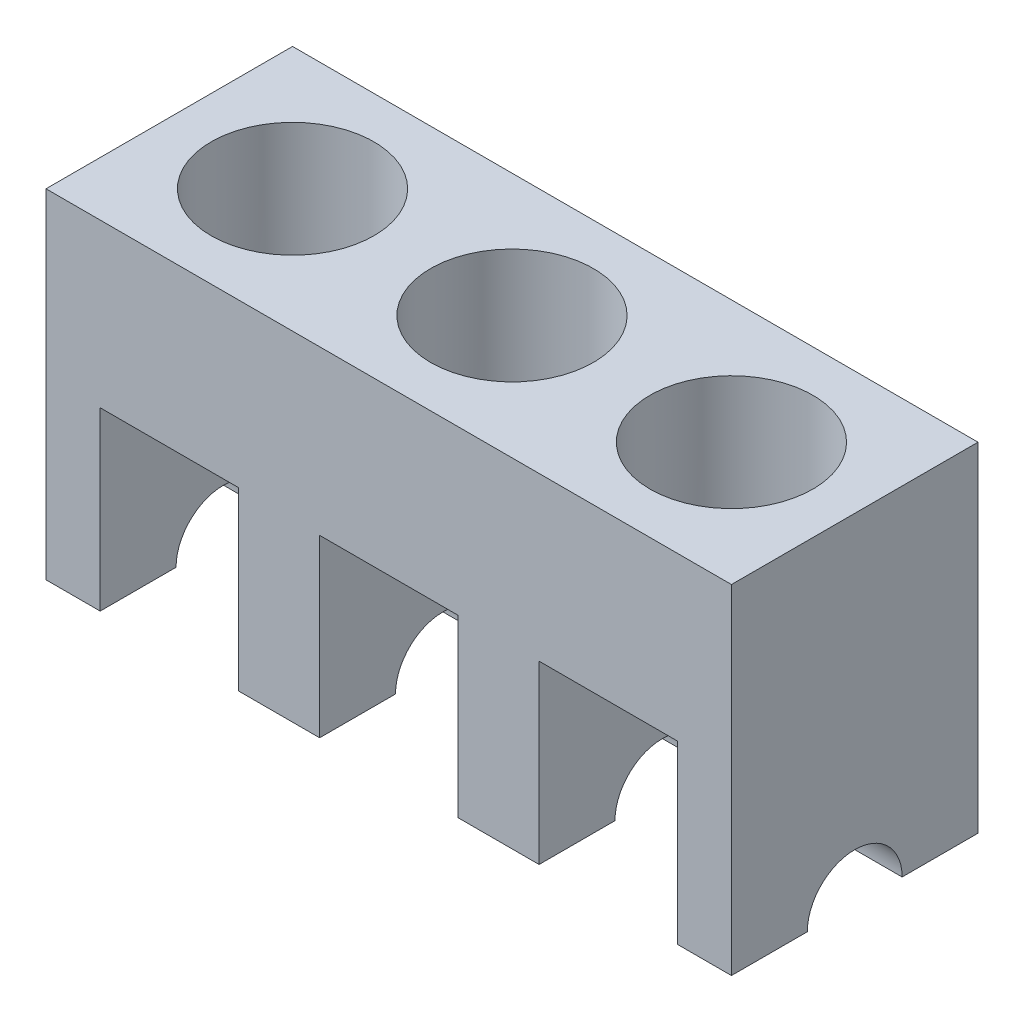
ISO-10303-21;
HEADER;
FILE_DESCRIPTION(('STEP AP214'),'2;1');
FILE_NAME('part.step','',(''),(''),'','','');
FILE_SCHEMA(('AUTOMOTIVE_DESIGN { 1 0 10303 214 1 1 1 1 }'));
ENDSEC;
DATA;
#1=APPLICATION_CONTEXT('core data for automotive mechanical design processes');
#2=APPLICATION_PROTOCOL_DEFINITION('international standard','automotive_design',2000,#1);
#3=PRODUCT_CONTEXT('',#1,'mechanical');
#4=PRODUCT('Part','Part','',(#3));
#5=PRODUCT_RELATED_PRODUCT_CATEGORY('part','',(#4));
#6=PRODUCT_DEFINITION_FORMATION('','',#4);
#7=PRODUCT_DEFINITION_CONTEXT('part definition',#1,'design');
#8=PRODUCT_DEFINITION('design','',#6,#7);
#9=PRODUCT_DEFINITION_SHAPE('','',#8);
#10=(LENGTH_UNIT() NAMED_UNIT(*) SI_UNIT(.MILLI.,.METRE.));
#11=(NAMED_UNIT(*) PLANE_ANGLE_UNIT() SI_UNIT($,.RADIAN.));
#12=(NAMED_UNIT(*) SI_UNIT($,.STERADIAN.) SOLID_ANGLE_UNIT());
#13=UNCERTAINTY_MEASURE_WITH_UNIT(LENGTH_MEASURE(1.E-05),#10,'distance_accuracy_value','');
#14=(GEOMETRIC_REPRESENTATION_CONTEXT(3) GLOBAL_UNCERTAINTY_ASSIGNED_CONTEXT((#13)) GLOBAL_UNIT_ASSIGNED_CONTEXT((#10,
#11,#12)) REPRESENTATION_CONTEXT('',''));
#15=CARTESIAN_POINT('',(0.,0.,0.));
#16=DIRECTION('',(0.,0.,1.));
#17=DIRECTION('',(1.,0.,0.));
#18=AXIS2_PLACEMENT_3D('',#15,#16,#17);
#19=CARTESIAN_POINT('',(0.,0.,0.));
#20=DIRECTION('',(0.,1.,0.));
#21=DIRECTION('',(0.,0.,1.));
#22=AXIS2_PLACEMENT_3D('',#19,#20,#21);
#23=PLANE('',#22);
#24=DIRECTION('',(0.,0.,1.));
#25=VECTOR('',#24,1.);
#26=CARTESIAN_POINT('',(-56.7788309636654,0.,-2284.41500789889));
#27=LINE('',#26,#25);
#28=CARTESIAN_POINT('',(-56.7788309636654,0.,-684.215007898894));
#29=VERTEX_POINT('',#28);
#30=CARTESIAN_POINT('',(-56.7788309636651,0.,26.9849921011058));
#31=VERTEX_POINT('',#30);
#32=EDGE_CURVE('E289',#29,#31,#27,.T.);
#33=ORIENTED_EDGE('',*,*,#32,.F.);
#34=DIRECTION('',(1.,0.,0.));
#35=VECTOR('',#34,1.);
#36=CARTESIAN_POINT('',(-56.7788309636654,0.,-684.215007898894));
#37=LINE('',#36,#35);
#38=CARTESIAN_POINT('',(451.221169036335,0.,-684.215007898894));
#39=VERTEX_POINT('',#38);
#40=EDGE_CURVE('E269',#29,#39,#37,.T.);
#41=ORIENTED_EDGE('',*,*,#40,.T.);
#42=DIRECTION('',(0.,0.,1.));
#43=VECTOR('',#42,1.);
#44=CARTESIAN_POINT('',(451.221169036335,0.,-2284.41500789889));
#45=LINE('',#44,#43);
#46=CARTESIAN_POINT('',(451.221169036335,0.,26.9849921011058));
#47=VERTEX_POINT('',#46);
#48=EDGE_CURVE('E554',#39,#47,#45,.T.);
#49=ORIENTED_EDGE('',*,*,#48,.T.);
#50=DIRECTION('',(1.,0.,0.));
#51=VECTOR('',#50,1.);
#52=CARTESIAN_POINT('',(-56.7788309636651,0.,26.9849921011058));
#53=LINE('',#52,#51);
#54=EDGE_CURVE('E293',#31,#47,#53,.T.);
#55=ORIENTED_EDGE('',*,*,#54,.F.);
#56=EDGE_LOOP('',(#33,#41,#49,#55));
#57=FACE_BOUND('',#56,.T.);
#58=ADVANCED_FACE('F35',(#57),#23,.F.);
#59=DIRECTION('',(0.,0.,1.));
#60=VECTOR('',#59,1.);
#61=CARTESIAN_POINT('',(1746.62116903633,0.,-2284.41500789889));
#62=LINE('',#61,#60);
#63=CARTESIAN_POINT('',(1746.62116903633,0.,-684.215007898894));
#64=VERTEX_POINT('',#63);
#65=CARTESIAN_POINT('',(1746.62116903633,0.,26.9849921011058));
#66=VERTEX_POINT('',#65);
#67=EDGE_CURVE('E540',#64,#66,#62,.T.);
#68=ORIENTED_EDGE('',*,*,#67,.F.);
#69=DIRECTION('',(1.,0.,0.));
#70=VECTOR('',#69,1.);
#71=CARTESIAN_POINT('',(-56.7788309636654,0.,-684.215007898894));
#72=LINE('',#71,#70);
#73=CARTESIAN_POINT('',(2508.62116903633,0.,-684.215007898894));
#74=VERTEX_POINT('',#73);
#75=EDGE_CURVE('E542',#64,#74,#72,.T.);
#76=ORIENTED_EDGE('',*,*,#75,.T.);
#77=DIRECTION('',(0.,0.,1.));
#78=VECTOR('',#77,1.);
#79=CARTESIAN_POINT('',(2508.62116903633,0.,0.));
#80=LINE('',#79,#78);
#81=CARTESIAN_POINT('',(2508.62116903633,0.,26.9849921011058));
#82=VERTEX_POINT('',#81);
#83=EDGE_CURVE('E414',#74,#82,#80,.T.);
#84=ORIENTED_EDGE('',*,*,#83,.T.);
#85=EDGE_CURVE('E300',#66,#82,#53,.T.);
#86=ORIENTED_EDGE('',*,*,#85,.F.);
#87=EDGE_LOOP('',(#68,#76,#84,#86));
#88=FACE_BOUND('',#87,.T.);
#89=ADVANCED_FACE('F538',(#88),#23,.F.);
#90=DIRECTION('',(0.,0.,-1.));
#91=VECTOR('',#90,1.);
#92=CARTESIAN_POINT('',(3804.02116903633,0.,0.));
#93=LINE('',#92,#91);
#94=CARTESIAN_POINT('',(3804.02116903633,0.,26.9849921011058));
#95=VERTEX_POINT('',#94);
#96=CARTESIAN_POINT('',(3804.02116903633,0.,-684.215007898894));
#97=VERTEX_POINT('',#96);
#98=EDGE_CURVE('E405',#95,#97,#93,.T.);
#99=ORIENTED_EDGE('',*,*,#98,.T.);
#100=DIRECTION('',(1.,0.,0.));
#101=VECTOR('',#100,1.);
#102=CARTESIAN_POINT('',(-56.7788309636654,0.,-684.215007898894));
#103=LINE('',#102,#101);
#104=CARTESIAN_POINT('',(4566.02116903633,0.,-684.215007898894));
#105=VERTEX_POINT('',#104);
#106=EDGE_CURVE('E520',#97,#105,#103,.T.);
#107=ORIENTED_EDGE('',*,*,#106,.T.);
#108=DIRECTION('',(0.,0.,1.));
#109=VECTOR('',#108,1.);
#110=CARTESIAN_POINT('',(4566.02116903633,0.,-2284.41500789889));
#111=LINE('',#110,#109);
#112=CARTESIAN_POINT('',(4566.02116903633,0.,26.9849921011058));
#113=VERTEX_POINT('',#112);
#114=EDGE_CURVE('E384',#105,#113,#111,.T.);
#115=ORIENTED_EDGE('',*,*,#114,.T.);
#116=EDGE_CURVE('E291',#95,#113,#53,.T.);
#117=ORIENTED_EDGE('',*,*,#116,.F.);
#118=EDGE_LOOP('',(#99,#107,#115,#117));
#119=FACE_BOUND('',#118,.T.);
#120=ADVANCED_FACE('F518',(#119),#23,.F.);
#121=DIRECTION('',(0.,0.,1.));
#122=VECTOR('',#121,1.);
#123=CARTESIAN_POINT('',(5861.42116903634,0.,-2284.41500789889));
#124=LINE('',#123,#122);
#125=CARTESIAN_POINT('',(5861.42116903634,0.,-684.215007898894));
#126=VERTEX_POINT('',#125);
#127=CARTESIAN_POINT('',(5861.42116903634,0.,26.9849921011058));
#128=VERTEX_POINT('',#127);
#129=EDGE_CURVE('E380',#126,#128,#124,.T.);
#130=ORIENTED_EDGE('',*,*,#129,.F.);
#131=DIRECTION('',(1.,0.,0.));
#132=VECTOR('',#131,1.);
#133=CARTESIAN_POINT('',(-56.7788309636654,0.,-684.215007898894));
#134=LINE('',#133,#132);
#135=CARTESIAN_POINT('',(6369.42116903633,0.,-684.215007898894));
#136=VERTEX_POINT('',#135);
#137=EDGE_CURVE('E594',#126,#136,#134,.T.);
#138=ORIENTED_EDGE('',*,*,#137,.T.);
#139=DIRECTION('',(0.,0.,-1.));
#140=VECTOR('',#139,1.);
#141=CARTESIAN_POINT('',(6369.42116903633,0.,26.9849921011058));
#142=LINE('',#141,#140);
#143=CARTESIAN_POINT('',(6369.42116903633,0.,26.9849921011058));
#144=VERTEX_POINT('',#143);
#145=EDGE_CURVE('E301',#144,#136,#142,.T.);
#146=ORIENTED_EDGE('',*,*,#145,.F.);
#147=EDGE_CURVE('E288',#128,#144,#53,.T.);
#148=ORIENTED_EDGE('',*,*,#147,.F.);
#149=EDGE_LOOP('',(#130,#138,#146,#148));
#150=FACE_BOUND('',#149,.T.);
#151=ADVANCED_FACE('F650',(#150),#23,.F.);
#152=CARTESIAN_POINT('',(451.221169036335,0.,-2284.41500789889));
#153=VERTEX_POINT('',#152);
#154=CARTESIAN_POINT('',(451.221169036335,0.,-1573.21500789889));
#155=VERTEX_POINT('',#154);
#156=EDGE_CURVE('E282',#153,#155,#45,.T.);
#157=ORIENTED_EDGE('',*,*,#156,.T.);
#158=DIRECTION('',(1.,0.,0.));
#159=VECTOR('',#158,1.);
#160=CARTESIAN_POINT('',(-56.7788309636654,0.,-1573.21500789889));
#161=LINE('',#160,#159);
#162=CARTESIAN_POINT('',(-56.7788309636654,0.,-1573.21500789889));
#163=VERTEX_POINT('',#162);
#164=EDGE_CURVE('E50',#155,#163,#161,.F.);
#165=ORIENTED_EDGE('',*,*,#164,.T.);
#166=CARTESIAN_POINT('',(-56.7788309636654,0.,-2284.41500789889));
#167=VERTEX_POINT('',#166);
#168=EDGE_CURVE('E280',#167,#163,#27,.T.);
#169=ORIENTED_EDGE('',*,*,#168,.F.);
#170=DIRECTION('',(-1.,0.,0.));
#171=VECTOR('',#170,1.);
#172=CARTESIAN_POINT('',(6369.42116903633,0.,-2284.41500789889));
#173=LINE('',#172,#171);
#174=EDGE_CURVE('E433',#153,#167,#173,.T.);
#175=ORIENTED_EDGE('',*,*,#174,.F.);
#176=EDGE_LOOP('',(#157,#165,#169,#175));
#177=FACE_BOUND('',#176,.T.);
#178=ADVANCED_FACE('F278',(#177),#23,.F.);
#179=CARTESIAN_POINT('',(2508.62116903633,0.,-2284.41500789889));
#180=VERTEX_POINT('',#179);
#181=CARTESIAN_POINT('',(2508.62116903633,0.,-1573.21500789889));
#182=VERTEX_POINT('',#181);
#183=EDGE_CURVE('E415',#180,#182,#80,.T.);
#184=ORIENTED_EDGE('',*,*,#183,.T.);
#185=DIRECTION('',(1.,0.,0.));
#186=VECTOR('',#185,1.);
#187=CARTESIAN_POINT('',(-56.7788309636654,0.,-1573.21500789889));
#188=LINE('',#187,#186);
#189=CARTESIAN_POINT('',(1746.62116903633,0.,-1573.21500789889));
#190=VERTEX_POINT('',#189);
#191=EDGE_CURVE('E58',#182,#190,#188,.F.);
#192=ORIENTED_EDGE('',*,*,#191,.T.);
#193=CARTESIAN_POINT('',(1746.62116903633,0.,-2284.41500789889));
#194=VERTEX_POINT('',#193);
#195=EDGE_CURVE('E555',#194,#190,#62,.T.);
#196=ORIENTED_EDGE('',*,*,#195,.F.);
#197=EDGE_CURVE('E468',#180,#194,#173,.T.);
#198=ORIENTED_EDGE('',*,*,#197,.F.);
#199=EDGE_LOOP('',(#184,#192,#196,#198));
#200=FACE_BOUND('',#199,.T.);
#201=ADVANCED_FACE('F641',(#200),#23,.F.);
#202=CARTESIAN_POINT('',(4566.02116903633,0.,-2284.41500789889));
#203=VERTEX_POINT('',#202);
#204=CARTESIAN_POINT('',(4566.02116903633,0.,-1573.21500789889));
#205=VERTEX_POINT('',#204);
#206=EDGE_CURVE('E381',#203,#205,#111,.T.);
#207=ORIENTED_EDGE('',*,*,#206,.T.);
#208=DIRECTION('',(1.,0.,0.));
#209=VECTOR('',#208,1.);
#210=CARTESIAN_POINT('',(-56.7788309636654,0.,-1573.21500789889));
#211=LINE('',#210,#209);
#212=CARTESIAN_POINT('',(3804.02116903633,0.,-1573.21500789889));
#213=VERTEX_POINT('',#212);
#214=EDGE_CURVE('E482',#205,#213,#211,.F.);
#215=ORIENTED_EDGE('',*,*,#214,.T.);
#216=CARTESIAN_POINT('',(3804.02116903633,0.,-2284.41500789889));
#217=VERTEX_POINT('',#216);
#218=EDGE_CURVE('E404',#213,#217,#93,.T.);
#219=ORIENTED_EDGE('',*,*,#218,.T.);
#220=EDGE_CURVE('E470',#203,#217,#173,.T.);
#221=ORIENTED_EDGE('',*,*,#220,.F.);
#222=EDGE_LOOP('',(#207,#215,#219,#221));
#223=FACE_BOUND('',#222,.T.);
#224=ADVANCED_FACE('F479',(#223),#23,.F.);
#225=CARTESIAN_POINT('',(0.,1117.6,0.));
#226=DIRECTION('',(0.,1.,0.));
#227=DIRECTION('',(0.,0.,1.));
#228=AXIS2_PLACEMENT_3D('',#225,#226,#227);
#229=PLANE('',#228);
#230=DIRECTION('',(0.,0.,1.));
#231=VECTOR('',#230,1.);
#232=CARTESIAN_POINT('',(4566.02116903633,1117.6,0.));
#233=LINE('',#232,#231);
#234=CARTESIAN_POINT('',(4566.02116903633,1117.6,-1532.52907761415));
#235=VERTEX_POINT('',#234);
#236=CARTESIAN_POINT('',(4566.02116903633,1117.6,-724.900938183634));
#237=VERTEX_POINT('',#236);
#238=EDGE_CURVE('E334',#235,#237,#233,.T.);
#239=ORIENTED_EDGE('',*,*,#238,.F.);
#240=CARTESIAN_POINT('',(5213.72116903633,1117.6,-1128.71500789889));
#241=DIRECTION('',(0.,1.,0.));
#242=DIRECTION('',(0.,0.,1.));
#243=AXIS2_PLACEMENT_3D('',#240,#241,#242);
#244=CIRCLE('',#243,763.27);
#245=EDGE_CURVE('E438',#237,#235,#244,.F.);
#246=ORIENTED_EDGE('',*,*,#245,.F.);
#247=EDGE_LOOP('',(#239,#246));
#248=FACE_BOUND('',#247,.T.);
#249=ADVANCED_FACE('F612',(#248),#229,.T.);
#250=CARTESIAN_POINT('',(0.,1117.6,0.));
#251=DIRECTION('',(0.,1.,0.));
#252=DIRECTION('',(0.,0.,1.));
#253=AXIS2_PLACEMENT_3D('',#250,#251,#252);
#254=PLANE('',#253);
#255=DIRECTION('',(0.,0.,1.));
#256=VECTOR('',#255,1.);
#257=CARTESIAN_POINT('',(2508.62116903633,1117.6,0.));
#258=LINE('',#257,#256);
#259=CARTESIAN_POINT('',(2508.62116903633,1117.6,-1532.52907761415));
#260=VERTEX_POINT('',#259);
#261=CARTESIAN_POINT('',(2508.62116903633,1117.6,-724.900938183634));
#262=VERTEX_POINT('',#261);
#263=EDGE_CURVE('E326',#260,#262,#258,.T.);
#264=ORIENTED_EDGE('',*,*,#263,.F.);
#265=CARTESIAN_POINT('',(3156.32116903633,1117.6,-1128.71500789889));
#266=DIRECTION('',(0.,1.,0.));
#267=DIRECTION('',(0.,0.,1.));
#268=AXIS2_PLACEMENT_3D('',#265,#266,#267);
#269=CIRCLE('',#268,763.27);
#270=EDGE_CURVE('E429',#262,#260,#269,.F.);
#271=ORIENTED_EDGE('',*,*,#270,.F.);
#272=EDGE_LOOP('',(#264,#271));
#273=FACE_BOUND('',#272,.T.);
#274=ADVANCED_FACE('F622',(#273),#254,.T.);
#275=CARTESIAN_POINT('',(0.,1117.6,0.));
#276=DIRECTION('',(0.,1.,0.));
#277=DIRECTION('',(0.,0.,1.));
#278=AXIS2_PLACEMENT_3D('',#275,#276,#277);
#279=PLANE('',#278);
#280=DIRECTION('',(0.,0.,1.));
#281=VECTOR('',#280,1.);
#282=CARTESIAN_POINT('',(451.221169036335,1117.6,0.));
#283=LINE('',#282,#281);
#284=CARTESIAN_POINT('',(451.221169036335,1117.6,-1532.52907761415));
#285=VERTEX_POINT('',#284);
#286=CARTESIAN_POINT('',(451.221169036335,1117.6,-724.900938183634));
#287=VERTEX_POINT('',#286);
#288=EDGE_CURVE('E318',#285,#287,#283,.T.);
#289=ORIENTED_EDGE('',*,*,#288,.F.);
#290=CARTESIAN_POINT('',(1098.92116903633,1117.6,-1128.71500789889));
#291=DIRECTION('',(0.,1.,0.));
#292=DIRECTION('',(0.,0.,1.));
#293=AXIS2_PLACEMENT_3D('',#290,#291,#292);
#294=CIRCLE('',#293,763.27);
#295=EDGE_CURVE('E430',#287,#285,#294,.F.);
#296=ORIENTED_EDGE('',*,*,#295,.F.);
#297=EDGE_LOOP('',(#289,#296));
#298=FACE_BOUND('',#297,.T.);
#299=ADVANCED_FACE('F662',(#298),#279,.T.);
#300=CARTESIAN_POINT('',(6369.42116903633,3175.,-2284.41500789889));
#301=DIRECTION('',(0.,0.,1.));
#302=DIRECTION('',(1.,0.,0.));
#303=AXIS2_PLACEMENT_3D('',#300,#301,#302);
#304=PLANE('',#303);
#305=DIRECTION('',(-1.,0.,0.));
#306=VECTOR('',#305,1.);
#307=CARTESIAN_POINT('',(451.221169036335,1651.,-2284.41500789889));
#308=LINE('',#307,#306);
#309=CARTESIAN_POINT('',(1746.62116903633,1651.,-2284.41500789889));
#310=VERTEX_POINT('',#309);
#311=CARTESIAN_POINT('',(451.221169036335,1651.,-2284.41500789889));
#312=VERTEX_POINT('',#311);
#313=EDGE_CURVE('E565',#310,#312,#308,.T.);
#314=ORIENTED_EDGE('',*,*,#313,.T.);
#315=DIRECTION('',(0.,-1.,0.));
#316=VECTOR('',#315,1.);
#317=CARTESIAN_POINT('',(451.221169036335,0.,-2284.41500789889));
#318=LINE('',#317,#316);
#319=EDGE_CURVE('E467',#312,#153,#318,.T.);
#320=ORIENTED_EDGE('',*,*,#319,.T.);
#321=ORIENTED_EDGE('',*,*,#174,.T.);
#322=DIRECTION('',(0.,-1.,0.));
#323=VECTOR('',#322,1.);
#324=CARTESIAN_POINT('',(-56.7788309636654,3175.,-2284.41500789889));
#325=LINE('',#324,#323);
#326=CARTESIAN_POINT('',(-56.7788309636654,3175.,-2284.41500789889));
#327=VERTEX_POINT('',#326);
#328=EDGE_CURVE('E287',#327,#167,#325,.T.);
#329=ORIENTED_EDGE('',*,*,#328,.F.);
#330=DIRECTION('',(-1.,0.,0.));
#331=VECTOR('',#330,1.);
#332=CARTESIAN_POINT('',(6369.42116903633,3175.,-2284.41500789889));
#333=LINE('',#332,#331);
#334=CARTESIAN_POINT('',(6369.42116903633,3175.,-2284.41500789889));
#335=VERTEX_POINT('',#334);
#336=EDGE_CURVE('E304',#335,#327,#333,.T.);
#337=ORIENTED_EDGE('',*,*,#336,.F.);
#338=DIRECTION('',(0.,-1.,0.));
#339=VECTOR('',#338,1.);
#340=CARTESIAN_POINT('',(6369.42116903633,3175.,-2284.41500789889));
#341=LINE('',#340,#339);
#342=CARTESIAN_POINT('',(6369.42116903633,0.,-2284.41500789889));
#343=VERTEX_POINT('',#342);
#344=EDGE_CURVE('E305',#335,#343,#341,.T.);
#345=ORIENTED_EDGE('',*,*,#344,.T.);
#346=CARTESIAN_POINT('',(5861.42116903634,0.,-2284.41500789889));
#347=VERTEX_POINT('',#346);
#348=EDGE_CURVE('E294',#343,#347,#173,.T.);
#349=ORIENTED_EDGE('',*,*,#348,.T.);
#350=DIRECTION('',(0.,1.,0.));
#351=VECTOR('',#350,1.);
#352=CARTESIAN_POINT('',(5861.42116903634,0.,-2284.41500789889));
#353=LINE('',#352,#351);
#354=CARTESIAN_POINT('',(5861.42116903634,1651.,-2284.41500789889));
#355=VERTEX_POINT('',#354);
#356=EDGE_CURVE('E514',#347,#355,#353,.T.);
#357=ORIENTED_EDGE('',*,*,#356,.T.);
#358=DIRECTION('',(-1.,0.,0.));
#359=VECTOR('',#358,1.);
#360=CARTESIAN_POINT('',(4566.02116903633,1651.,-2284.41500789889));
#361=LINE('',#360,#359);
#362=CARTESIAN_POINT('',(4566.02116903633,1651.,-2284.41500789889));
#363=VERTEX_POINT('',#362);
#364=EDGE_CURVE('E373',#355,#363,#361,.T.);
#365=ORIENTED_EDGE('',*,*,#364,.T.);
#366=DIRECTION('',(0.,-1.,0.));
#367=VECTOR('',#366,1.);
#368=CARTESIAN_POINT('',(4566.02116903633,0.,-2284.41500789889));
#369=LINE('',#368,#367);
#370=EDGE_CURVE('E363',#363,#203,#369,.T.);
#371=ORIENTED_EDGE('',*,*,#370,.T.);
#372=ORIENTED_EDGE('',*,*,#220,.T.);
#373=DIRECTION('',(0.,1.,0.));
#374=VECTOR('',#373,1.);
#375=CARTESIAN_POINT('',(3804.02116903633,-7.15828160284104,-2284.41500789889));
#376=LINE('',#375,#374);
#377=CARTESIAN_POINT('',(3804.02116903633,1643.84171839716,-2284.41500789889));
#378=VERTEX_POINT('',#377);
#379=EDGE_CURVE('E477',#217,#378,#376,.T.);
#380=ORIENTED_EDGE('',*,*,#379,.T.);
#381=DIRECTION('',(-1.,0.,0.));
#382=VECTOR('',#381,1.);
#383=CARTESIAN_POINT('',(2508.62116903633,1643.84171839716,-2284.41500789889));
#384=LINE('',#383,#382);
#385=CARTESIAN_POINT('',(2508.62116903633,1643.84171839716,-2284.41500789889));
#386=VERTEX_POINT('',#385);
#387=EDGE_CURVE('E489',#378,#386,#384,.T.);
#388=ORIENTED_EDGE('',*,*,#387,.T.);
#389=DIRECTION('',(0.,-1.,0.));
#390=VECTOR('',#389,1.);
#391=CARTESIAN_POINT('',(2508.62116903633,-7.15828160284104,-2284.41500789889));
#392=LINE('',#391,#390);
#393=EDGE_CURVE('E490',#386,#180,#392,.T.);
#394=ORIENTED_EDGE('',*,*,#393,.T.);
#395=ORIENTED_EDGE('',*,*,#197,.T.);
#396=DIRECTION('',(0.,1.,0.));
#397=VECTOR('',#396,1.);
#398=CARTESIAN_POINT('',(1746.62116903633,0.,-2284.41500789889));
#399=LINE('',#398,#397);
#400=EDGE_CURVE('E567',#194,#310,#399,.T.);
#401=ORIENTED_EDGE('',*,*,#400,.T.);
#402=EDGE_LOOP('',(#314,#320,#321,#329,#337,#345,#349,#357,#365,#371,#372,#380,#388,#394,#395,#401));
#403=FACE_BOUND('',#402,.T.);
#404=ADVANCED_FACE('F37',(#403),#304,.F.);
#405=CARTESIAN_POINT('',(-56.7788309636654,3175.,-2284.41500789889));
#406=DIRECTION('',(1.,0.,0.));
#407=DIRECTION('',(0.,0.,-1.));
#408=AXIS2_PLACEMENT_3D('',#405,#406,#407);
#409=PLANE('',#408);
#410=ORIENTED_EDGE('',*,*,#168,.T.);
#411=CARTESIAN_POINT('',(-56.7788309636654,0.,-1128.71500789889));
#412=DIRECTION('',(1.,0.,0.));
#413=DIRECTION('',(0.,0.,-1.));
#414=AXIS2_PLACEMENT_3D('',#411,#412,#413);
#415=CIRCLE('',#414,444.5);
#416=EDGE_CURVE('E266',#163,#29,#415,.T.);
#417=ORIENTED_EDGE('',*,*,#416,.T.);
#418=ORIENTED_EDGE('',*,*,#32,.T.);
#419=DIRECTION('',(0.,-1.,0.));
#420=VECTOR('',#419,1.);
#421=CARTESIAN_POINT('',(-56.7788309636651,3175.,26.9849921011058));
#422=LINE('',#421,#420);
#423=CARTESIAN_POINT('',(-56.7788309636651,3175.,26.9849921011058));
#424=VERTEX_POINT('',#423);
#425=EDGE_CURVE('E312',#424,#31,#422,.T.);
#426=ORIENTED_EDGE('',*,*,#425,.F.);
#427=DIRECTION('',(0.,0.,1.));
#428=VECTOR('',#427,1.);
#429=CARTESIAN_POINT('',(-56.7788309636654,3175.,-2284.41500789889));
#430=LINE('',#429,#428);
#431=EDGE_CURVE('E447',#327,#424,#430,.T.);
#432=ORIENTED_EDGE('',*,*,#431,.F.);
#433=ORIENTED_EDGE('',*,*,#328,.T.);
#434=EDGE_LOOP('',(#410,#417,#418,#426,#432,#433));
#435=FACE_BOUND('',#434,.T.);
#436=ADVANCED_FACE('F285',(#435),#409,.F.);
#437=CARTESIAN_POINT('',(-56.7788309636651,3175.,26.9849921011058));
#438=DIRECTION('',(0.,0.,-1.));
#439=DIRECTION('',(-1.,0.,0.));
#440=AXIS2_PLACEMENT_3D('',#437,#438,#439);
#441=PLANE('',#440);
#442=ORIENTED_EDGE('',*,*,#54,.T.);
#443=DIRECTION('',(0.,-1.,0.));
#444=VECTOR('',#443,1.);
#445=CARTESIAN_POINT('',(451.221169036335,0.,26.9849921011058));
#446=LINE('',#445,#444);
#447=CARTESIAN_POINT('',(451.221169036335,1651.,26.9849921011058));
#448=VERTEX_POINT('',#447);
#449=EDGE_CURVE('E502',#448,#47,#446,.T.);
#450=ORIENTED_EDGE('',*,*,#449,.F.);
#451=DIRECTION('',(-1.,0.,0.));
#452=VECTOR('',#451,1.);
#453=CARTESIAN_POINT('',(451.221169036335,1651.,26.9849921011058));
#454=LINE('',#453,#452);
#455=CARTESIAN_POINT('',(1746.62116903633,1651.,26.9849921011058));
#456=VERTEX_POINT('',#455);
#457=EDGE_CURVE('E571',#456,#448,#454,.T.);
#458=ORIENTED_EDGE('',*,*,#457,.F.);
#459=DIRECTION('',(0.,1.,0.));
#460=VECTOR('',#459,1.);
#461=CARTESIAN_POINT('',(1746.62116903633,0.,26.9849921011058));
#462=LINE('',#461,#460);
#463=EDGE_CURVE('E535',#66,#456,#462,.T.);
#464=ORIENTED_EDGE('',*,*,#463,.F.);
#465=ORIENTED_EDGE('',*,*,#85,.T.);
#466=DIRECTION('',(0.,-1.,0.));
#467=VECTOR('',#466,1.);
#468=CARTESIAN_POINT('',(2508.62116903633,-7.15828160284104,26.9849921011058));
#469=LINE('',#468,#467);
#470=CARTESIAN_POINT('',(2508.62116903633,1643.84171839716,26.9849921011058));
#471=VERTEX_POINT('',#470);
#472=EDGE_CURVE('E365',#471,#82,#469,.T.);
#473=ORIENTED_EDGE('',*,*,#472,.F.);
#474=DIRECTION('',(-1.,0.,0.));
#475=VECTOR('',#474,1.);
#476=CARTESIAN_POINT('',(2508.62116903633,1643.84171839716,26.9849921011058));
#477=LINE('',#476,#475);
#478=CARTESIAN_POINT('',(3804.02116903633,1643.84171839716,26.9849921011058));
#479=VERTEX_POINT('',#478);
#480=EDGE_CURVE('E495',#479,#471,#477,.T.);
#481=ORIENTED_EDGE('',*,*,#480,.F.);
#482=DIRECTION('',(0.,1.,0.));
#483=VECTOR('',#482,1.);
#484=CARTESIAN_POINT('',(3804.02116903633,-7.15828160284104,26.9849921011058));
#485=LINE('',#484,#483);
#486=EDGE_CURVE('E369',#95,#479,#485,.T.);
#487=ORIENTED_EDGE('',*,*,#486,.F.);
#488=ORIENTED_EDGE('',*,*,#116,.T.);
#489=DIRECTION('',(0.,-1.,0.));
#490=VECTOR('',#489,1.);
#491=CARTESIAN_POINT('',(4566.02116903633,0.,26.9849921011058));
#492=LINE('',#491,#490);
#493=CARTESIAN_POINT('',(4566.02116903633,1651.,26.9849921011058));
#494=VERTEX_POINT('',#493);
#495=EDGE_CURVE('E505',#494,#113,#492,.T.);
#496=ORIENTED_EDGE('',*,*,#495,.F.);
#497=DIRECTION('',(-1.,0.,0.));
#498=VECTOR('',#497,1.);
#499=CARTESIAN_POINT('',(4566.02116903633,1651.,26.9849921011058));
#500=LINE('',#499,#498);
#501=CARTESIAN_POINT('',(5861.42116903634,1651.,26.9849921011058));
#502=VERTEX_POINT('',#501);
#503=EDGE_CURVE('E511',#502,#494,#500,.T.);
#504=ORIENTED_EDGE('',*,*,#503,.F.);
#505=DIRECTION('',(0.,1.,0.));
#506=VECTOR('',#505,1.);
#507=CARTESIAN_POINT('',(5861.42116903634,0.,26.9849921011058));
#508=LINE('',#507,#506);
#509=EDGE_CURVE('E508',#128,#502,#508,.T.);
#510=ORIENTED_EDGE('',*,*,#509,.F.);
#511=ORIENTED_EDGE('',*,*,#147,.T.);
#512=DIRECTION('',(0.,-1.,0.));
#513=VECTOR('',#512,1.);
#514=CARTESIAN_POINT('',(6369.42116903633,3175.,26.9849921011058));
#515=LINE('',#514,#513);
#516=CARTESIAN_POINT('',(6369.42116903633,3175.,26.9849921011058));
#517=VERTEX_POINT('',#516);
#518=EDGE_CURVE('E308',#517,#144,#515,.T.);
#519=ORIENTED_EDGE('',*,*,#518,.F.);
#520=DIRECTION('',(1.,0.,0.));
#521=VECTOR('',#520,1.);
#522=CARTESIAN_POINT('',(-56.7788309636651,3175.,26.9849921011058));
#523=LINE('',#522,#521);
#524=EDGE_CURVE('E449',#424,#517,#523,.T.);
#525=ORIENTED_EDGE('',*,*,#524,.F.);
#526=ORIENTED_EDGE('',*,*,#425,.T.);
#527=EDGE_LOOP('',(#442,#450,#458,#464,#465,#473,#481,#487,#488,#496,#504,#510,#511,#519,#525,#526));
#528=FACE_BOUND('',#527,.T.);
#529=ADVANCED_FACE('F527',(#528),#441,.F.);
#530=CARTESIAN_POINT('',(6369.42116903633,3175.,26.9849921011058));
#531=DIRECTION('',(-1.,0.,0.));
#532=DIRECTION('',(0.,0.,1.));
#533=AXIS2_PLACEMENT_3D('',#530,#531,#532);
#534=PLANE('',#533);
#535=ORIENTED_EDGE('',*,*,#145,.T.);
#536=CARTESIAN_POINT('',(6369.42116903633,0.,-1128.71500789889));
#537=DIRECTION('',(-1.,0.,0.));
#538=DIRECTION('',(0.,0.,1.));
#539=AXIS2_PLACEMENT_3D('',#536,#537,#538);
#540=CIRCLE('',#539,444.5);
#541=CARTESIAN_POINT('',(6369.42116903633,0.,-1573.21500789889));
#542=VERTEX_POINT('',#541);
#543=EDGE_CURVE('E592',#136,#542,#540,.T.);
#544=ORIENTED_EDGE('',*,*,#543,.T.);
#545=EDGE_CURVE('E299',#542,#343,#142,.T.);
#546=ORIENTED_EDGE('',*,*,#545,.T.);
#547=ORIENTED_EDGE('',*,*,#344,.F.);
#548=DIRECTION('',(0.,0.,-1.));
#549=VECTOR('',#548,1.);
#550=CARTESIAN_POINT('',(6369.42116903633,3175.,26.9849921011058));
#551=LINE('',#550,#549);
#552=EDGE_CURVE('E309',#517,#335,#551,.T.);
#553=ORIENTED_EDGE('',*,*,#552,.F.);
#554=ORIENTED_EDGE('',*,*,#518,.T.);
#555=EDGE_LOOP('',(#535,#544,#546,#547,#553,#554));
#556=FACE_BOUND('',#555,.T.);
#557=ADVANCED_FACE('F458',(#556),#534,.F.);
#558=CARTESIAN_POINT('',(0.,3175.,0.));
#559=DIRECTION('',(0.,1.,0.));
#560=DIRECTION('',(0.,0.,1.));
#561=AXIS2_PLACEMENT_3D('',#558,#559,#560);
#562=PLANE('',#561);
#563=CARTESIAN_POINT('',(1098.92116903633,3175.,-1128.71500789889));
#564=DIRECTION('',(0.,1.,0.));
#565=DIRECTION('',(0.,0.,1.));
#566=AXIS2_PLACEMENT_3D('',#563,#564,#565);
#567=CIRCLE('',#566,763.27);
#568=CARTESIAN_POINT('',(1098.92116903633,3175.,-365.445007898894));
#569=VERTEX_POINT('',#568);
#570=EDGE_CURVE('E425',#569,#569,#567,.T.);
#571=ORIENTED_EDGE('',*,*,#570,.F.);
#572=EDGE_LOOP('',(#571));
#573=FACE_BOUND('',#572,.T.);
#574=CARTESIAN_POINT('',(3156.32116903633,3175.,-1128.71500789889));
#575=DIRECTION('',(0.,1.,0.));
#576=DIRECTION('',(0.,0.,1.));
#577=AXIS2_PLACEMENT_3D('',#574,#575,#576);
#578=CIRCLE('',#577,763.27);
#579=CARTESIAN_POINT('',(3156.32116903633,3175.,-365.445007898894));
#580=VERTEX_POINT('',#579);
#581=EDGE_CURVE('E434',#580,#580,#578,.T.);
#582=ORIENTED_EDGE('',*,*,#581,.F.);
#583=EDGE_LOOP('',(#582));
#584=FACE_BOUND('',#583,.T.);
#585=CARTESIAN_POINT('',(5213.72116903633,3175.,-1128.71500789889));
#586=DIRECTION('',(0.,1.,0.));
#587=DIRECTION('',(0.,0.,1.));
#588=AXIS2_PLACEMENT_3D('',#585,#586,#587);
#589=CIRCLE('',#588,763.27);
#590=CARTESIAN_POINT('',(5213.72116903633,3175.,-365.445007898894));
#591=VERTEX_POINT('',#590);
#592=EDGE_CURVE('E424',#591,#591,#589,.T.);
#593=ORIENTED_EDGE('',*,*,#592,.F.);
#594=EDGE_LOOP('',(#593));
#595=FACE_BOUND('',#594,.T.);
#596=ORIENTED_EDGE('',*,*,#336,.T.);
#597=ORIENTED_EDGE('',*,*,#431,.T.);
#598=ORIENTED_EDGE('',*,*,#524,.T.);
#599=ORIENTED_EDGE('',*,*,#552,.T.);
#600=EDGE_LOOP('',(#596,#597,#598,#599));
#601=FACE_BOUND('',#600,.T.);
#602=ADVANCED_FACE('F453',(#573,#584,#595,#601),#562,.T.);
#603=ORIENTED_EDGE('',*,*,#545,.F.);
#604=DIRECTION('',(1.,0.,0.));
#605=VECTOR('',#604,1.);
#606=CARTESIAN_POINT('',(-56.7788309636654,0.,-1573.21500789889));
#607=LINE('',#606,#605);
#608=CARTESIAN_POINT('',(5861.42116903634,0.,-1573.21500789889));
#609=VERTEX_POINT('',#608);
#610=EDGE_CURVE('E273',#542,#609,#607,.F.);
#611=ORIENTED_EDGE('',*,*,#610,.T.);
#612=EDGE_CURVE('E377',#347,#609,#124,.T.);
#613=ORIENTED_EDGE('',*,*,#612,.F.);
#614=ORIENTED_EDGE('',*,*,#348,.F.);
#615=EDGE_LOOP('',(#603,#611,#613,#614));
#616=FACE_BOUND('',#615,.T.);
#617=ADVANCED_FACE('F600',(#616),#23,.F.);
#618=CARTESIAN_POINT('',(5213.72116903633,-3098.65357150502,-1128.71500789889));
#619=DIRECTION('',(0.,1.,0.));
#620=DIRECTION('',(0.,0.,1.));
#621=AXIS2_PLACEMENT_3D('',#618,#619,#620);
#622=CYLINDRICAL_SURFACE('',#621,763.27);
#623=ORIENTED_EDGE('',*,*,#245,.T.);
#624=DIRECTION('',(0.,1.,0.));
#625=VECTOR('',#624,1.);
#626=CARTESIAN_POINT('',(4566.02116903633,-3098.65357150502,-1532.52907761415));
#627=LINE('',#626,#625);
#628=CARTESIAN_POINT('',(4566.02116903633,1651.,-1532.52907761415));
#629=VERTEX_POINT('',#628);
#630=EDGE_CURVE('E349',#235,#629,#627,.T.);
#631=ORIENTED_EDGE('',*,*,#630,.T.);
#632=CARTESIAN_POINT('',(5213.72116903633,1651.,-1128.71500789889));
#633=DIRECTION('',(0.,1.,0.));
#634=DIRECTION('',(0.,0.,1.));
#635=AXIS2_PLACEMENT_3D('',#632,#633,#634);
#636=CIRCLE('',#635,763.27);
#637=CARTESIAN_POINT('',(5861.42116903634,1651.,-1532.52907761415));
#638=VERTEX_POINT('',#637);
#639=EDGE_CURVE('E43',#629,#638,#636,.F.);
#640=ORIENTED_EDGE('',*,*,#639,.T.);
#641=DIRECTION('',(0.,1.,0.));
#642=VECTOR('',#641,1.);
#643=CARTESIAN_POINT('',(5861.42116903634,-3098.65357150502,-1532.52907761415));
#644=LINE('',#643,#642);
#645=CARTESIAN_POINT('',(5861.42116903634,1117.6,-1532.52907761415));
#646=VERTEX_POINT('',#645);
#647=EDGE_CURVE('E347',#638,#646,#644,.F.);
#648=ORIENTED_EDGE('',*,*,#647,.T.);
#649=CARTESIAN_POINT('',(5861.42116903634,1117.6,-724.900938183637));
#650=VERTEX_POINT('',#649);
#651=EDGE_CURVE('E443',#646,#650,#244,.F.);
#652=ORIENTED_EDGE('',*,*,#651,.T.);
#653=DIRECTION('',(0.,1.,0.));
#654=VECTOR('',#653,1.);
#655=CARTESIAN_POINT('',(5861.42116903634,-3098.65357150502,-724.900938183637));
#656=LINE('',#655,#654);
#657=CARTESIAN_POINT('',(5861.42116903634,1651.,-724.900938183637));
#658=VERTEX_POINT('',#657);
#659=EDGE_CURVE('E418',#650,#658,#656,.T.);
#660=ORIENTED_EDGE('',*,*,#659,.T.);
#661=CARTESIAN_POINT('',(4566.02116903633,1651.,-724.900938183634));
#662=VERTEX_POINT('',#661);
#663=EDGE_CURVE('E335',#658,#662,#636,.F.);
#664=ORIENTED_EDGE('',*,*,#663,.T.);
#665=DIRECTION('',(0.,1.,0.));
#666=VECTOR('',#665,1.);
#667=CARTESIAN_POINT('',(4566.02116903633,-3098.65357150502,-724.900938183634));
#668=LINE('',#667,#666);
#669=EDGE_CURVE('E422',#662,#237,#668,.F.);
#670=ORIENTED_EDGE('',*,*,#669,.T.);
#671=EDGE_LOOP('',(#623,#631,#640,#648,#652,#660,#664,#670));
#672=FACE_BOUND('',#671,.T.);
#673=ORIENTED_EDGE('',*,*,#592,.T.);
#674=EDGE_LOOP('',(#673));
#675=FACE_BOUND('',#674,.T.);
#676=ADVANCED_FACE('F344',(#672,#675),#622,.F.);
#677=DIRECTION('',(0.,0.,-1.));
#678=VECTOR('',#677,1.);
#679=CARTESIAN_POINT('',(5861.42116903634,1117.6,0.));
#680=LINE('',#679,#678);
#681=EDGE_CURVE('E332',#650,#646,#680,.T.);
#682=ORIENTED_EDGE('',*,*,#681,.F.);
#683=ORIENTED_EDGE('',*,*,#651,.F.);
#684=EDGE_LOOP('',(#682,#683));
#685=FACE_BOUND('',#684,.T.);
#686=ADVANCED_FACE('F608',(#685),#229,.T.);
#687=CARTESIAN_POINT('',(3156.32116903633,-3098.65357150502,-1128.71500789889));
#688=DIRECTION('',(0.,1.,0.));
#689=DIRECTION('',(0.,0.,1.));
#690=AXIS2_PLACEMENT_3D('',#687,#688,#689);
#691=CYLINDRICAL_SURFACE('',#690,763.27);
#692=ORIENTED_EDGE('',*,*,#270,.T.);
#693=DIRECTION('',(0.,1.,0.));
#694=VECTOR('',#693,1.);
#695=CARTESIAN_POINT('',(2508.62116903633,-3098.65357150502,-1532.52907761415));
#696=LINE('',#695,#694);
#697=CARTESIAN_POINT('',(2508.62116903633,1643.84171839716,-1532.52907761415));
#698=VERTEX_POINT('',#697);
#699=EDGE_CURVE('E408',#260,#698,#696,.T.);
#700=ORIENTED_EDGE('',*,*,#699,.T.);
#701=CARTESIAN_POINT('',(3156.32116903633,1643.84171839716,-1128.71500789889));
#702=DIRECTION('',(0.,1.,0.));
#703=DIRECTION('',(0.,0.,1.));
#704=AXIS2_PLACEMENT_3D('',#701,#702,#703);
#705=CIRCLE('',#704,763.27);
#706=CARTESIAN_POINT('',(3804.02116903633,1643.84171839716,-1532.52907761415));
#707=VERTEX_POINT('',#706);
#708=EDGE_CURVE('E331',#698,#707,#705,.F.);
#709=ORIENTED_EDGE('',*,*,#708,.T.);
#710=DIRECTION('',(0.,1.,0.));
#711=VECTOR('',#710,1.);
#712=CARTESIAN_POINT('',(3804.02116903633,-3098.65357150502,-1532.52907761415));
#713=LINE('',#712,#711);
#714=CARTESIAN_POINT('',(3804.02116903633,1117.6,-1532.52907761415));
#715=VERTEX_POINT('',#714);
#716=EDGE_CURVE('E401',#707,#715,#713,.F.);
#717=ORIENTED_EDGE('',*,*,#716,.T.);
#718=CARTESIAN_POINT('',(3804.02116903633,1117.6,-724.900938183636));
#719=VERTEX_POINT('',#718);
#720=EDGE_CURVE('E437',#715,#719,#269,.F.);
#721=ORIENTED_EDGE('',*,*,#720,.T.);
#722=DIRECTION('',(0.,1.,0.));
#723=VECTOR('',#722,1.);
#724=CARTESIAN_POINT('',(3804.02116903633,-3098.65357150502,-724.900938183637));
#725=LINE('',#724,#723);
#726=CARTESIAN_POINT('',(3804.02116903633,1643.84171839716,-724.900938183636));
#727=VERTEX_POINT('',#726);
#728=EDGE_CURVE('E398',#719,#727,#725,.T.);
#729=ORIENTED_EDGE('',*,*,#728,.T.);
#730=CARTESIAN_POINT('',(2508.62116903633,1643.84171839716,-724.900938183634));
#731=VERTEX_POINT('',#730);
#732=EDGE_CURVE('E328',#727,#731,#705,.F.);
#733=ORIENTED_EDGE('',*,*,#732,.T.);
#734=DIRECTION('',(0.,1.,0.));
#735=VECTOR('',#734,1.);
#736=CARTESIAN_POINT('',(2508.62116903633,-3098.65357150502,-724.900938183634));
#737=LINE('',#736,#735);
#738=EDGE_CURVE('E411',#731,#262,#737,.F.);
#739=ORIENTED_EDGE('',*,*,#738,.T.);
#740=EDGE_LOOP('',(#692,#700,#709,#717,#721,#729,#733,#739));
#741=FACE_BOUND('',#740,.T.);
#742=ORIENTED_EDGE('',*,*,#581,.T.);
#743=EDGE_LOOP('',(#742));
#744=FACE_BOUND('',#743,.T.);
#745=ADVANCED_FACE('F610',(#741,#744),#691,.F.);
#746=DIRECTION('',(0.,0.,-1.));
#747=VECTOR('',#746,1.);
#748=CARTESIAN_POINT('',(3804.02116903633,1117.6,0.));
#749=LINE('',#748,#747);
#750=EDGE_CURVE('E324',#719,#715,#749,.T.);
#751=ORIENTED_EDGE('',*,*,#750,.F.);
#752=ORIENTED_EDGE('',*,*,#720,.F.);
#753=EDGE_LOOP('',(#751,#752));
#754=FACE_BOUND('',#753,.T.);
#755=ADVANCED_FACE('F617',(#754),#254,.T.);
#756=CARTESIAN_POINT('',(1098.92116903633,-3098.65357150502,-1128.71500789889));
#757=DIRECTION('',(0.,1.,0.));
#758=DIRECTION('',(0.,0.,1.));
#759=AXIS2_PLACEMENT_3D('',#756,#757,#758);
#760=CYLINDRICAL_SURFACE('',#759,763.27);
#761=ORIENTED_EDGE('',*,*,#295,.T.);
#762=DIRECTION('',(0.,1.,0.));
#763=VECTOR('',#762,1.);
#764=CARTESIAN_POINT('',(451.221169036335,-3098.65357150502,-1532.52907761415));
#765=LINE('',#764,#763);
#766=CARTESIAN_POINT('',(451.221169036335,1651.,-1532.52907761415));
#767=VERTEX_POINT('',#766);
#768=EDGE_CURVE('E392',#285,#767,#765,.T.);
#769=ORIENTED_EDGE('',*,*,#768,.T.);
#770=CARTESIAN_POINT('',(1098.92116903633,1651.,-1128.71500789889));
#771=DIRECTION('',(0.,1.,0.));
#772=DIRECTION('',(-1.,0.,0.));
#773=AXIS2_PLACEMENT_3D('',#770,#771,#772);
#774=CIRCLE('',#773,763.27);
#775=CARTESIAN_POINT('',(1746.62116903633,1651.,-1532.52907761415));
#776=VERTEX_POINT('',#775);
#777=EDGE_CURVE('E323',#767,#776,#774,.F.);
#778=ORIENTED_EDGE('',*,*,#777,.T.);
#779=DIRECTION('',(0.,1.,0.));
#780=VECTOR('',#779,1.);
#781=CARTESIAN_POINT('',(1746.62116903633,-3098.65357150502,-1532.52907761415));
#782=LINE('',#781,#780);
#783=CARTESIAN_POINT('',(1746.62116903633,1117.6,-1532.52907761415));
#784=VERTEX_POINT('',#783);
#785=EDGE_CURVE('E388',#776,#784,#782,.F.);
#786=ORIENTED_EDGE('',*,*,#785,.T.);
#787=CARTESIAN_POINT('',(1746.62116903633,1117.6,-724.900938183635));
#788=VERTEX_POINT('',#787);
#789=EDGE_CURVE('E428',#784,#788,#294,.F.);
#790=ORIENTED_EDGE('',*,*,#789,.T.);
#791=DIRECTION('',(0.,1.,0.));
#792=VECTOR('',#791,1.);
#793=CARTESIAN_POINT('',(1746.62116903633,-3098.65357150502,-724.900938183635));
#794=LINE('',#793,#792);
#795=CARTESIAN_POINT('',(1746.62116903633,1651.,-724.900938183636));
#796=VERTEX_POINT('',#795);
#797=EDGE_CURVE('E385',#788,#796,#794,.T.);
#798=ORIENTED_EDGE('',*,*,#797,.T.);
#799=CARTESIAN_POINT('',(451.221169036335,1651.,-724.900938183634));
#800=VERTEX_POINT('',#799);
#801=EDGE_CURVE('E320',#796,#800,#774,.F.);
#802=ORIENTED_EDGE('',*,*,#801,.T.);
#803=DIRECTION('',(0.,1.,0.));
#804=VECTOR('',#803,1.);
#805=CARTESIAN_POINT('',(451.221169036335,-3098.65357150502,-724.900938183635));
#806=LINE('',#805,#804);
#807=EDGE_CURVE('E395',#800,#287,#806,.F.);
#808=ORIENTED_EDGE('',*,*,#807,.T.);
#809=EDGE_LOOP('',(#761,#769,#778,#786,#790,#798,#802,#808));
#810=FACE_BOUND('',#809,.T.);
#811=ORIENTED_EDGE('',*,*,#570,.T.);
#812=EDGE_LOOP('',(#811));
#813=FACE_BOUND('',#812,.T.);
#814=ADVANCED_FACE('F672',(#810,#813),#760,.F.);
#815=DIRECTION('',(0.,0.,-1.));
#816=VECTOR('',#815,1.);
#817=CARTESIAN_POINT('',(1746.62116903633,1117.6,0.));
#818=LINE('',#817,#816);
#819=EDGE_CURVE('E316',#788,#784,#818,.T.);
#820=ORIENTED_EDGE('',*,*,#819,.F.);
#821=ORIENTED_EDGE('',*,*,#789,.F.);
#822=EDGE_LOOP('',(#820,#821));
#823=FACE_BOUND('',#822,.T.);
#824=ADVANCED_FACE('F669',(#823),#279,.T.);
#825=CARTESIAN_POINT('',(451.221169036335,1651.,-2284.41500789889));
#826=DIRECTION('',(0.,1.,0.));
#827=DIRECTION('',(-1.,0.,0.));
#828=AXIS2_PLACEMENT_3D('',#825,#826,#827);
#829=PLANE('',#828);
#830=DIRECTION('',(0.,0.,1.));
#831=VECTOR('',#830,1.);
#832=CARTESIAN_POINT('',(451.221169036335,1651.,-2284.41500789889));
#833=LINE('',#832,#831);
#834=EDGE_CURVE('E389',#312,#767,#833,.T.);
#835=ORIENTED_EDGE('',*,*,#834,.F.);
#836=ORIENTED_EDGE('',*,*,#313,.F.);
#837=DIRECTION('',(0.,0.,1.));
#838=VECTOR('',#837,1.);
#839=CARTESIAN_POINT('',(1746.62116903633,1651.,-2284.41500789889));
#840=LINE('',#839,#838);
#841=EDGE_CURVE('E559',#310,#776,#840,.T.);
#842=ORIENTED_EDGE('',*,*,#841,.T.);
#843=ORIENTED_EDGE('',*,*,#777,.F.);
#844=EDGE_LOOP('',(#835,#836,#842,#843));
#845=FACE_BOUND('',#844,.T.);
#846=ADVANCED_FACE('F693',(#845),#829,.F.);
#847=EDGE_CURVE('E558',#796,#456,#840,.T.);
#848=ORIENTED_EDGE('',*,*,#847,.T.);
#849=ORIENTED_EDGE('',*,*,#457,.T.);
#850=EDGE_CURVE('E562',#800,#448,#833,.T.);
#851=ORIENTED_EDGE('',*,*,#850,.F.);
#852=ORIENTED_EDGE('',*,*,#801,.F.);
#853=EDGE_LOOP('',(#848,#849,#851,#852));
#854=FACE_BOUND('',#853,.T.);
#855=ADVANCED_FACE('F696',(#854),#829,.F.);
#856=CARTESIAN_POINT('',(451.221169036335,0.,-2284.41500789889));
#857=DIRECTION('',(-1.,0.,0.));
#858=DIRECTION('',(0.,0.,1.));
#859=AXIS2_PLACEMENT_3D('',#856,#857,#858);
#860=PLANE('',#859);
#861=ORIENTED_EDGE('',*,*,#48,.F.);
#862=CARTESIAN_POINT('',(451.221169036335,0.,-1128.71500789889));
#863=DIRECTION('',(-1.,0.,0.));
#864=DIRECTION('',(0.,0.,1.));
#865=AXIS2_PLACEMENT_3D('',#862,#863,#864);
#866=CIRCLE('',#865,444.5);
#867=EDGE_CURVE('E283',#39,#155,#866,.T.);
#868=ORIENTED_EDGE('',*,*,#867,.T.);
#869=ORIENTED_EDGE('',*,*,#156,.F.);
#870=ORIENTED_EDGE('',*,*,#319,.F.);
#871=ORIENTED_EDGE('',*,*,#834,.T.);
#872=ORIENTED_EDGE('',*,*,#768,.F.);
#873=ORIENTED_EDGE('',*,*,#288,.T.);
#874=ORIENTED_EDGE('',*,*,#807,.F.);
#875=ORIENTED_EDGE('',*,*,#850,.T.);
#876=ORIENTED_EDGE('',*,*,#449,.T.);
#877=EDGE_LOOP('',(#861,#868,#869,#870,#871,#872,#873,#874,#875,#876));
#878=FACE_BOUND('',#877,.T.);
#879=ADVANCED_FACE('F701',(#878),#860,.F.);
#880=CARTESIAN_POINT('',(1746.62116903633,0.,-2284.41500789889));
#881=DIRECTION('',(1.,0.,0.));
#882=DIRECTION('',(0.,0.,-1.));
#883=AXIS2_PLACEMENT_3D('',#880,#881,#882);
#884=PLANE('',#883);
#885=ORIENTED_EDGE('',*,*,#195,.T.);
#886=CARTESIAN_POINT('',(1746.62116903633,0.,-1128.71500789889));
#887=DIRECTION('',(1.,0.,0.));
#888=DIRECTION('',(0.,0.,-1.));
#889=AXIS2_PLACEMENT_3D('',#886,#887,#888);
#890=CIRCLE('',#889,444.5);
#891=EDGE_CURVE('E579',#190,#64,#890,.T.);
#892=ORIENTED_EDGE('',*,*,#891,.T.);
#893=ORIENTED_EDGE('',*,*,#67,.T.);
#894=ORIENTED_EDGE('',*,*,#463,.T.);
#895=ORIENTED_EDGE('',*,*,#847,.F.);
#896=ORIENTED_EDGE('',*,*,#797,.F.);
#897=ORIENTED_EDGE('',*,*,#819,.T.);
#898=ORIENTED_EDGE('',*,*,#785,.F.);
#899=ORIENTED_EDGE('',*,*,#841,.F.);
#900=ORIENTED_EDGE('',*,*,#400,.F.);
#901=EDGE_LOOP('',(#885,#892,#893,#894,#895,#896,#897,#898,#899,#900));
#902=FACE_BOUND('',#901,.T.);
#903=ADVANCED_FACE('F698',(#902),#884,.F.);
#904=CARTESIAN_POINT('',(2508.62116903633,1643.84171839716,-2284.41500789889));
#905=DIRECTION('',(0.,1.,0.));
#906=DIRECTION('',(0.,0.,1.));
#907=AXIS2_PLACEMENT_3D('',#904,#905,#906);
#908=PLANE('',#907);
#909=DIRECTION('',(0.,0.,1.));
#910=VECTOR('',#909,1.);
#911=CARTESIAN_POINT('',(2508.62116903633,1643.84171839716,-2284.41500789889));
#912=LINE('',#911,#910);
#913=EDGE_CURVE('E499',#386,#698,#912,.T.);
#914=ORIENTED_EDGE('',*,*,#913,.F.);
#915=ORIENTED_EDGE('',*,*,#387,.F.);
#916=DIRECTION('',(0.,0.,1.));
#917=VECTOR('',#916,1.);
#918=CARTESIAN_POINT('',(3804.02116903633,1643.84171839716,-2284.41500789889));
#919=LINE('',#918,#917);
#920=EDGE_CURVE('E487',#378,#707,#919,.T.);
#921=ORIENTED_EDGE('',*,*,#920,.T.);
#922=ORIENTED_EDGE('',*,*,#708,.F.);
#923=EDGE_LOOP('',(#914,#915,#921,#922));
#924=FACE_BOUND('',#923,.T.);
#925=ADVANCED_FACE('F655',(#924),#908,.F.);
#926=EDGE_CURVE('E492',#727,#479,#919,.T.);
#927=ORIENTED_EDGE('',*,*,#926,.T.);
#928=ORIENTED_EDGE('',*,*,#480,.T.);
#929=EDGE_CURVE('E503',#731,#471,#912,.T.);
#930=ORIENTED_EDGE('',*,*,#929,.F.);
#931=ORIENTED_EDGE('',*,*,#732,.F.);
#932=EDGE_LOOP('',(#927,#928,#930,#931));
#933=FACE_BOUND('',#932,.T.);
#934=ADVANCED_FACE('F549',(#933),#908,.F.);
#935=CARTESIAN_POINT('',(2508.62116903633,-7.15828160284104,-2284.41500789889));
#936=DIRECTION('',(-1.,0.,0.));
#937=DIRECTION('',(0.,0.,1.));
#938=AXIS2_PLACEMENT_3D('',#935,#936,#937);
#939=PLANE('',#938);
#940=ORIENTED_EDGE('',*,*,#83,.F.);
#941=CARTESIAN_POINT('',(2508.62116903633,0.,-1128.71500789889));
#942=DIRECTION('',(-1.,0.,0.));
#943=DIRECTION('',(0.,0.,1.));
#944=AXIS2_PLACEMENT_3D('',#941,#942,#943);
#945=CIRCLE('',#944,444.5);
#946=EDGE_CURVE('E584',#74,#182,#945,.T.);
#947=ORIENTED_EDGE('',*,*,#946,.T.);
#948=ORIENTED_EDGE('',*,*,#183,.F.);
#949=ORIENTED_EDGE('',*,*,#393,.F.);
#950=ORIENTED_EDGE('',*,*,#913,.T.);
#951=ORIENTED_EDGE('',*,*,#699,.F.);
#952=ORIENTED_EDGE('',*,*,#263,.T.);
#953=ORIENTED_EDGE('',*,*,#738,.F.);
#954=ORIENTED_EDGE('',*,*,#929,.T.);
#955=ORIENTED_EDGE('',*,*,#472,.T.);
#956=EDGE_LOOP('',(#940,#947,#948,#949,#950,#951,#952,#953,#954,#955));
#957=FACE_BOUND('',#956,.T.);
#958=ADVANCED_FACE('F544',(#957),#939,.F.);
#959=CARTESIAN_POINT('',(3804.02116903633,-7.15828160284104,-2284.41500789889));
#960=DIRECTION('',(1.,0.,0.));
#961=DIRECTION('',(0.,0.,-1.));
#962=AXIS2_PLACEMENT_3D('',#959,#960,#961);
#963=PLANE('',#962);
#964=ORIENTED_EDGE('',*,*,#218,.F.);
#965=CARTESIAN_POINT('',(3804.02116903633,0.,-1128.71500789889));
#966=DIRECTION('',(1.,0.,0.));
#967=DIRECTION('',(0.,0.,-1.));
#968=AXIS2_PLACEMENT_3D('',#965,#966,#967);
#969=CIRCLE('',#968,444.5);
#970=EDGE_CURVE('E586',#213,#97,#969,.T.);
#971=ORIENTED_EDGE('',*,*,#970,.T.);
#972=ORIENTED_EDGE('',*,*,#98,.F.);
#973=ORIENTED_EDGE('',*,*,#486,.T.);
#974=ORIENTED_EDGE('',*,*,#926,.F.);
#975=ORIENTED_EDGE('',*,*,#728,.F.);
#976=ORIENTED_EDGE('',*,*,#750,.T.);
#977=ORIENTED_EDGE('',*,*,#716,.F.);
#978=ORIENTED_EDGE('',*,*,#920,.F.);
#979=ORIENTED_EDGE('',*,*,#379,.F.);
#980=EDGE_LOOP('',(#964,#971,#972,#973,#974,#975,#976,#977,#978,#979));
#981=FACE_BOUND('',#980,.T.);
#982=ADVANCED_FACE('F485',(#981),#963,.F.);
#983=CARTESIAN_POINT('',(4566.02116903633,1651.,-2284.41500789889));
#984=DIRECTION('',(0.,1.,0.));
#985=DIRECTION('',(0.,0.,1.));
#986=AXIS2_PLACEMENT_3D('',#983,#984,#985);
#987=PLANE('',#986);
#988=DIRECTION('',(0.,0.,1.));
#989=VECTOR('',#988,1.);
#990=CARTESIAN_POINT('',(4566.02116903633,1651.,-2284.41500789889));
#991=LINE('',#990,#989);
#992=EDGE_CURVE('E355',#363,#629,#991,.T.);
#993=ORIENTED_EDGE('',*,*,#992,.F.);
#994=ORIENTED_EDGE('',*,*,#364,.F.);
#995=DIRECTION('',(0.,0.,1.));
#996=VECTOR('',#995,1.);
#997=CARTESIAN_POINT('',(5861.42116903634,1651.,-2284.41500789889));
#998=LINE('',#997,#996);
#999=EDGE_CURVE('E357',#355,#638,#998,.T.);
#1000=ORIENTED_EDGE('',*,*,#999,.T.);
#1001=ORIENTED_EDGE('',*,*,#639,.F.);
#1002=EDGE_LOOP('',(#993,#994,#1000,#1001));
#1003=FACE_BOUND('',#1002,.T.);
#1004=ADVANCED_FACE('F353',(#1003),#987,.F.);
#1005=EDGE_CURVE('E376',#658,#502,#998,.T.);
#1006=ORIENTED_EDGE('',*,*,#1005,.T.);
#1007=ORIENTED_EDGE('',*,*,#503,.T.);
#1008=EDGE_CURVE('E366',#662,#494,#991,.T.);
#1009=ORIENTED_EDGE('',*,*,#1008,.F.);
#1010=ORIENTED_EDGE('',*,*,#663,.F.);
#1011=EDGE_LOOP('',(#1006,#1007,#1009,#1010));
#1012=FACE_BOUND('',#1011,.T.);
#1013=ADVANCED_FACE('F713',(#1012),#987,.F.);
#1014=CARTESIAN_POINT('',(4566.02116903633,0.,-2284.41500789889));
#1015=DIRECTION('',(-1.,0.,0.));
#1016=DIRECTION('',(0.,0.,1.));
#1017=AXIS2_PLACEMENT_3D('',#1014,#1015,#1016);
#1018=PLANE('',#1017);
#1019=ORIENTED_EDGE('',*,*,#114,.F.);
#1020=CARTESIAN_POINT('',(4566.02116903633,0.,-1128.71500789889));
#1021=DIRECTION('',(-1.,0.,0.));
#1022=DIRECTION('',(0.,0.,1.));
#1023=AXIS2_PLACEMENT_3D('',#1020,#1021,#1022);
#1024=CIRCLE('',#1023,444.5);
#1025=EDGE_CURVE('E590',#105,#205,#1024,.T.);
#1026=ORIENTED_EDGE('',*,*,#1025,.T.);
#1027=ORIENTED_EDGE('',*,*,#206,.F.);
#1028=ORIENTED_EDGE('',*,*,#370,.F.);
#1029=ORIENTED_EDGE('',*,*,#992,.T.);
#1030=ORIENTED_EDGE('',*,*,#630,.F.);
#1031=ORIENTED_EDGE('',*,*,#238,.T.);
#1032=ORIENTED_EDGE('',*,*,#669,.F.);
#1033=ORIENTED_EDGE('',*,*,#1008,.T.);
#1034=ORIENTED_EDGE('',*,*,#495,.T.);
#1035=EDGE_LOOP('',(#1019,#1026,#1027,#1028,#1029,#1030,#1031,#1032,#1033,#1034));
#1036=FACE_BOUND('',#1035,.T.);
#1037=ADVANCED_FACE('F360',(#1036),#1018,.F.);
#1038=CARTESIAN_POINT('',(5861.42116903634,0.,-2284.41500789889));
#1039=DIRECTION('',(1.,0.,0.));
#1040=DIRECTION('',(0.,0.,-1.));
#1041=AXIS2_PLACEMENT_3D('',#1038,#1039,#1040);
#1042=PLANE('',#1041);
#1043=ORIENTED_EDGE('',*,*,#612,.T.);
#1044=CARTESIAN_POINT('',(5861.42116903634,0.,-1128.71500789889));
#1045=DIRECTION('',(1.,0.,0.));
#1046=DIRECTION('',(0.,0.,-1.));
#1047=AXIS2_PLACEMENT_3D('',#1044,#1045,#1046);
#1048=CIRCLE('',#1047,444.5);
#1049=EDGE_CURVE('E12',#609,#126,#1048,.T.);
#1050=ORIENTED_EDGE('',*,*,#1049,.T.);
#1051=ORIENTED_EDGE('',*,*,#129,.T.);
#1052=ORIENTED_EDGE('',*,*,#509,.T.);
#1053=ORIENTED_EDGE('',*,*,#1005,.F.);
#1054=ORIENTED_EDGE('',*,*,#659,.F.);
#1055=ORIENTED_EDGE('',*,*,#681,.T.);
#1056=ORIENTED_EDGE('',*,*,#647,.F.);
#1057=ORIENTED_EDGE('',*,*,#999,.F.);
#1058=ORIENTED_EDGE('',*,*,#356,.F.);
#1059=EDGE_LOOP('',(#1043,#1050,#1051,#1052,#1053,#1054,#1055,#1056,#1057,#1058));
#1060=FACE_BOUND('',#1059,.T.);
#1061=ADVANCED_FACE('F603',(#1060),#1042,.F.);
#1062=CARTESIAN_POINT('',(-56.7788309636654,0.,-1128.71500789889));
#1063=DIRECTION('',(1.,0.,0.));
#1064=DIRECTION('',(0.,0.,-1.));
#1065=AXIS2_PLACEMENT_3D('',#1062,#1063,#1064);
#1066=CYLINDRICAL_SURFACE('',#1065,444.5);
#1067=ORIENTED_EDGE('',*,*,#137,.F.);
#1068=ORIENTED_EDGE('',*,*,#1049,.F.);
#1069=ORIENTED_EDGE('',*,*,#610,.F.);
#1070=ORIENTED_EDGE('',*,*,#543,.F.);
#1071=EDGE_LOOP('',(#1067,#1068,#1069,#1070));
#1072=FACE_BOUND('',#1071,.T.);
#1073=ADVANCED_FACE('F685',(#1072),#1066,.F.);
#1074=ORIENTED_EDGE('',*,*,#214,.F.);
#1075=ORIENTED_EDGE('',*,*,#1025,.F.);
#1076=ORIENTED_EDGE('',*,*,#106,.F.);
#1077=ORIENTED_EDGE('',*,*,#970,.F.);
#1078=EDGE_LOOP('',(#1074,#1075,#1076,#1077));
#1079=FACE_BOUND('',#1078,.T.);
#1080=ADVANCED_FACE('F682',(#1079),#1066,.F.);
#1081=ORIENTED_EDGE('',*,*,#191,.F.);
#1082=ORIENTED_EDGE('',*,*,#946,.F.);
#1083=ORIENTED_EDGE('',*,*,#75,.F.);
#1084=ORIENTED_EDGE('',*,*,#891,.F.);
#1085=EDGE_LOOP('',(#1081,#1082,#1083,#1084));
#1086=FACE_BOUND('',#1085,.T.);
#1087=ADVANCED_FACE('F684',(#1086),#1066,.F.);
#1088=ORIENTED_EDGE('',*,*,#416,.F.);
#1089=ORIENTED_EDGE('',*,*,#164,.F.);
#1090=ORIENTED_EDGE('',*,*,#867,.F.);
#1091=ORIENTED_EDGE('',*,*,#40,.F.);
#1092=EDGE_LOOP('',(#1088,#1089,#1090,#1091));
#1093=FACE_BOUND('',#1092,.T.);
#1094=ADVANCED_FACE('F267',(#1093),#1066,.F.);
#1095=CLOSED_SHELL('',(#58,#89,#120,#151,#178,#201,#224,#249,#274,#299,#404,#436,#529,#557,#602,
#617,#676,#686,#745,#755,#814,#824,#846,#855,#879,#903,#925,#934,#958,#982,#1004,#1013,#1037,
#1061,#1073,#1080,#1087,#1094));
#1096=MANIFOLD_SOLID_BREP('B2',#1095);
#1097=ADVANCED_BREP_SHAPE_REPRESENTATION('',(#18,#1096),#14);
#1098=SHAPE_DEFINITION_REPRESENTATION(#9,#1097);
ENDSEC;
END-ISO-10303-21;
